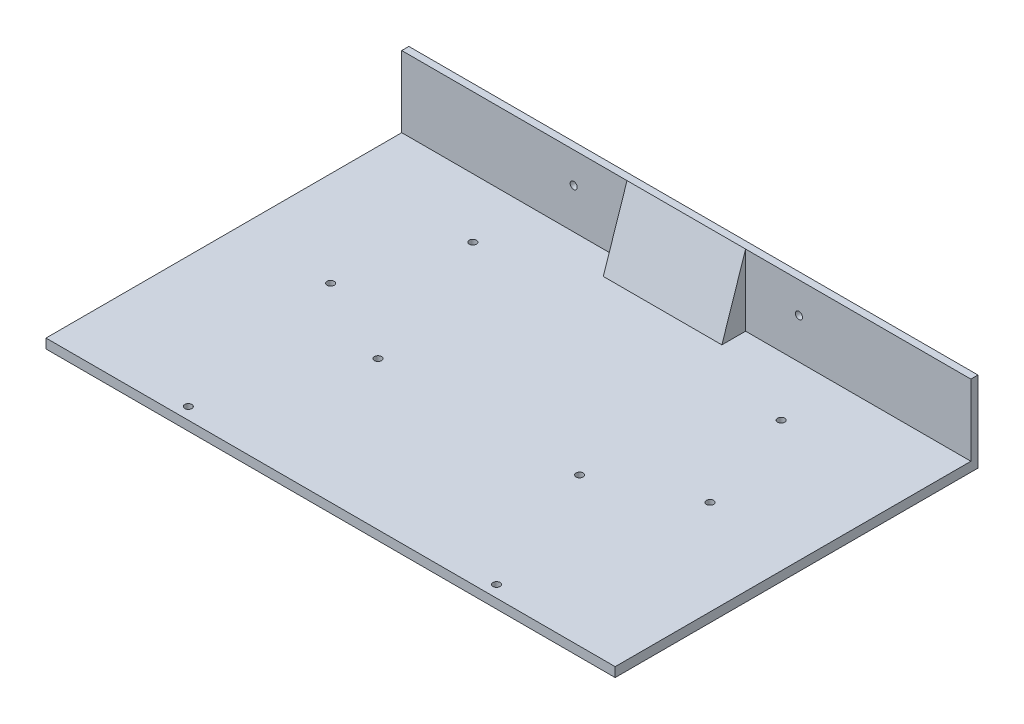
ISO-10303-21;
HEADER;
FILE_DESCRIPTION(('STEP AP214'),'2;1');
FILE_NAME('part.step','',(''),(''),'','','');
FILE_SCHEMA(('AUTOMOTIVE_DESIGN { 1 0 10303 214 1 1 1 1 }'));
ENDSEC;
DATA;
#1=APPLICATION_CONTEXT('core data for automotive mechanical design processes');
#2=APPLICATION_PROTOCOL_DEFINITION('international standard','automotive_design',2000,#1);
#3=PRODUCT_CONTEXT('',#1,'mechanical');
#4=PRODUCT('Part','Part','',(#3));
#5=PRODUCT_RELATED_PRODUCT_CATEGORY('part','',(#4));
#6=PRODUCT_DEFINITION_FORMATION('','',#4);
#7=PRODUCT_DEFINITION_CONTEXT('part definition',#1,'design');
#8=PRODUCT_DEFINITION('design','',#6,#7);
#9=PRODUCT_DEFINITION_SHAPE('','',#8);
#10=(LENGTH_UNIT() NAMED_UNIT(*) SI_UNIT(.MILLI.,.METRE.));
#11=(NAMED_UNIT(*) PLANE_ANGLE_UNIT() SI_UNIT($,.RADIAN.));
#12=(NAMED_UNIT(*) SI_UNIT($,.STERADIAN.) SOLID_ANGLE_UNIT());
#13=UNCERTAINTY_MEASURE_WITH_UNIT(LENGTH_MEASURE(1.E-05),#10,'distance_accuracy_value','');
#14=(GEOMETRIC_REPRESENTATION_CONTEXT(3) GLOBAL_UNCERTAINTY_ASSIGNED_CONTEXT((#13)) GLOBAL_UNIT_ASSIGNED_CONTEXT((#10,
#11,#12)) REPRESENTATION_CONTEXT('',''));
#15=CARTESIAN_POINT('',(0.,0.,0.));
#16=DIRECTION('',(0.,0.,1.));
#17=DIRECTION('',(1.,0.,0.));
#18=AXIS2_PLACEMENT_3D('',#15,#16,#17);
#19=CARTESIAN_POINT('',(0.,4.,0.));
#20=DIRECTION('',(0.,1.,0.));
#21=DIRECTION('',(0.,0.,1.));
#22=AXIS2_PLACEMENT_3D('',#19,#20,#21);
#23=PLANE('',#22);
#24=CARTESIAN_POINT('',(80.,4.,-5.));
#25=DIRECTION('',(0.,1.,0.));
#26=DIRECTION('',(0.,0.,1.));
#27=AXIS2_PLACEMENT_3D('',#24,#25,#26);
#28=CIRCLE('',#27,1.5);
#29=CARTESIAN_POINT('',(80.,4.,-3.50000000000001));
#30=VERTEX_POINT('',#29);
#31=EDGE_CURVE('E274',#30,#30,#28,.T.);
#32=ORIENTED_EDGE('',*,*,#31,.F.);
#33=EDGE_LOOP('',(#32));
#34=FACE_BOUND('',#33,.T.);
#35=CARTESIAN_POINT('',(-80.,4.,-5.));
#36=DIRECTION('',(0.,1.,0.));
#37=DIRECTION('',(0.,0.,1.));
#38=AXIS2_PLACEMENT_3D('',#35,#36,#37);
#39=CIRCLE('',#38,1.5);
#40=CARTESIAN_POINT('',(-80.,4.,-3.50000000000001));
#41=VERTEX_POINT('',#40);
#42=EDGE_CURVE('E284',#41,#41,#39,.T.);
#43=ORIENTED_EDGE('',*,*,#42,.F.);
#44=EDGE_LOOP('',(#43));
#45=FACE_BOUND('',#44,.T.);
#46=CARTESIAN_POINT('',(42.5,4.,12.5));
#47=DIRECTION('',(0.,1.,0.));
#48=DIRECTION('',(0.,0.,1.));
#49=AXIS2_PLACEMENT_3D('',#46,#47,#48);
#50=CIRCLE('',#49,1.5);
#51=CARTESIAN_POINT('',(42.5,4.,14.));
#52=VERTEX_POINT('',#51);
#53=EDGE_CURVE('E277',#52,#52,#50,.T.);
#54=ORIENTED_EDGE('',*,*,#53,.F.);
#55=EDGE_LOOP('',(#54));
#56=FACE_BOUND('',#55,.T.);
#57=CARTESIAN_POINT('',(-42.5,4.,12.5));
#58=DIRECTION('',(0.,1.,0.));
#59=DIRECTION('',(0.,0.,1.));
#60=AXIS2_PLACEMENT_3D('',#57,#58,#59);
#61=CIRCLE('',#60,1.5);
#62=CARTESIAN_POINT('',(-42.5,4.,14.));
#63=VERTEX_POINT('',#62);
#64=EDGE_CURVE('E270',#63,#63,#61,.T.);
#65=ORIENTED_EDGE('',*,*,#64,.F.);
#66=EDGE_LOOP('',(#65));
#67=FACE_BOUND('',#66,.T.);
#68=CARTESIAN_POINT('',(-65.,4.,70.));
#69=DIRECTION('',(0.,1.,0.));
#70=DIRECTION('',(0.,0.,1.));
#71=AXIS2_PLACEMENT_3D('',#68,#69,#70);
#72=CIRCLE('',#71,1.5);
#73=CARTESIAN_POINT('',(-65.,4.,71.5));
#74=VERTEX_POINT('',#73);
#75=EDGE_CURVE('E177',#74,#74,#72,.T.);
#76=ORIENTED_EDGE('',*,*,#75,.F.);
#77=EDGE_LOOP('',(#76));
#78=FACE_BOUND('',#77,.T.);
#79=CARTESIAN_POINT('',(65.,4.,70.));
#80=DIRECTION('',(0.,1.,0.));
#81=DIRECTION('',(0.,0.,1.));
#82=AXIS2_PLACEMENT_3D('',#79,#80,#81);
#83=CIRCLE('',#82,1.5);
#84=CARTESIAN_POINT('',(65.,4.,71.5));
#85=VERTEX_POINT('',#84);
#86=EDGE_CURVE('E182',#85,#85,#83,.T.);
#87=ORIENTED_EDGE('',*,*,#86,.F.);
#88=EDGE_LOOP('',(#87));
#89=FACE_BOUND('',#88,.T.);
#90=CARTESIAN_POINT('',(65.,4.,-50.));
#91=DIRECTION('',(0.,1.,0.));
#92=DIRECTION('',(0.,0.,1.));
#93=AXIS2_PLACEMENT_3D('',#90,#91,#92);
#94=CIRCLE('',#93,1.5);
#95=CARTESIAN_POINT('',(65.,4.,-48.5));
#96=VERTEX_POINT('',#95);
#97=EDGE_CURVE('E178',#96,#96,#94,.T.);
#98=ORIENTED_EDGE('',*,*,#97,.F.);
#99=EDGE_LOOP('',(#98));
#100=FACE_BOUND('',#99,.T.);
#101=CARTESIAN_POINT('',(-65.,4.,-50.));
#102=DIRECTION('',(0.,1.,0.));
#103=DIRECTION('',(0.,0.,1.));
#104=AXIS2_PLACEMENT_3D('',#101,#102,#103);
#105=CIRCLE('',#104,1.5);
#106=CARTESIAN_POINT('',(-65.,4.,-48.5));
#107=VERTEX_POINT('',#106);
#108=EDGE_CURVE('E181',#107,#107,#105,.T.);
#109=ORIENTED_EDGE('',*,*,#108,.F.);
#110=EDGE_LOOP('',(#109));
#111=FACE_BOUND('',#110,.T.);
#112=DIRECTION('',(-1.,0.,0.));
#113=VECTOR('',#112,1.);
#114=CARTESIAN_POINT('',(-120.,4.,-75.));
#115=LINE('',#114,#113);
#116=CARTESIAN_POINT('',(120.,4.,-75.));
#117=VERTEX_POINT('',#116);
#118=CARTESIAN_POINT('',(25.,4.,-75.));
#119=VERTEX_POINT('',#118);
#120=EDGE_CURVE('E128',#117,#119,#115,.T.);
#121=ORIENTED_EDGE('',*,*,#120,.T.);
#122=DIRECTION('',(0.,0.,-1.));
#123=VECTOR('',#122,1.);
#124=CARTESIAN_POINT('',(25.,4.,-75.));
#125=LINE('',#124,#123);
#126=CARTESIAN_POINT('',(25.,4.,-65.));
#127=VERTEX_POINT('',#126);
#128=EDGE_CURVE('E115',#127,#119,#125,.T.);
#129=ORIENTED_EDGE('',*,*,#128,.F.);
#130=DIRECTION('',(-1.,0.,0.));
#131=VECTOR('',#130,1.);
#132=CARTESIAN_POINT('',(25.,4.,-65.));
#133=LINE('',#132,#131);
#134=CARTESIAN_POINT('',(-25.,4.,-65.));
#135=VERTEX_POINT('',#134);
#136=EDGE_CURVE('E121',#127,#135,#133,.T.);
#137=ORIENTED_EDGE('',*,*,#136,.T.);
#138=DIRECTION('',(0.,0.,-1.));
#139=VECTOR('',#138,1.);
#140=CARTESIAN_POINT('',(-25.,4.,-75.));
#141=LINE('',#140,#139);
#142=CARTESIAN_POINT('',(-25.,4.,-75.));
#143=VERTEX_POINT('',#142);
#144=EDGE_CURVE('E137',#135,#143,#141,.T.);
#145=ORIENTED_EDGE('',*,*,#144,.T.);
#146=CARTESIAN_POINT('',(-120.,4.,-75.));
#147=VERTEX_POINT('',#146);
#148=EDGE_CURVE('E76',#143,#147,#115,.T.);
#149=ORIENTED_EDGE('',*,*,#148,.T.);
#150=DIRECTION('',(0.,0.,1.));
#151=VECTOR('',#150,1.);
#152=CARTESIAN_POINT('',(-120.,4.,-75.));
#153=LINE('',#152,#151);
#154=CARTESIAN_POINT('',(-120.,4.,75.));
#155=VERTEX_POINT('',#154);
#156=EDGE_CURVE('E193',#147,#155,#153,.T.);
#157=ORIENTED_EDGE('',*,*,#156,.T.);
#158=DIRECTION('',(1.,0.,0.));
#159=VECTOR('',#158,1.);
#160=CARTESIAN_POINT('',(-120.,4.,75.));
#161=LINE('',#160,#159);
#162=CARTESIAN_POINT('',(120.,4.,75.));
#163=VERTEX_POINT('',#162);
#164=EDGE_CURVE('E58',#155,#163,#161,.T.);
#165=ORIENTED_EDGE('',*,*,#164,.T.);
#166=DIRECTION('',(0.,0.,-1.));
#167=VECTOR('',#166,1.);
#168=CARTESIAN_POINT('',(120.,4.,-75.));
#169=LINE('',#168,#167);
#170=EDGE_CURVE('E190',#163,#117,#169,.T.);
#171=ORIENTED_EDGE('',*,*,#170,.T.);
#172=EDGE_LOOP('',(#121,#129,#137,#145,#149,#157,#165,#171));
#173=FACE_BOUND('',#172,.T.);
#174=ADVANCED_FACE('F32',(#34,#45,#56,#67,#78,#89,#100,#111,#173),#23,.T.);
#175=CARTESIAN_POINT('',(0.,0.,-75.));
#176=DIRECTION('',(0.,0.,1.));
#177=DIRECTION('',(1.,0.,0.));
#178=AXIS2_PLACEMENT_3D('',#175,#176,#177);
#179=PLANE('',#178);
#180=CARTESIAN_POINT('',(47.5,21.,-75.));
#181=DIRECTION('',(0.,0.,-1.));
#182=DIRECTION('',(-1.,0.,0.));
#183=AXIS2_PLACEMENT_3D('',#180,#181,#182);
#184=CIRCLE('',#183,1.5);
#185=CARTESIAN_POINT('',(46.,21.,-75.));
#186=VERTEX_POINT('',#185);
#187=EDGE_CURVE('E144',#186,#186,#184,.T.);
#188=ORIENTED_EDGE('',*,*,#187,.T.);
#189=EDGE_LOOP('',(#188));
#190=FACE_BOUND('',#189,.T.);
#191=DIRECTION('',(1.,0.,0.));
#192=VECTOR('',#191,1.);
#193=CARTESIAN_POINT('',(120.,34.,-75.));
#194=LINE('',#193,#192);
#195=CARTESIAN_POINT('',(25.,34.,-75.));
#196=VERTEX_POINT('',#195);
#197=CARTESIAN_POINT('',(120.,34.,-75.));
#198=VERTEX_POINT('',#197);
#199=EDGE_CURVE('E169',#196,#198,#194,.T.);
#200=ORIENTED_EDGE('',*,*,#199,.F.);
#201=DIRECTION('',(0.,1.,0.));
#202=VECTOR('',#201,1.);
#203=CARTESIAN_POINT('',(25.,34.,-75.));
#204=LINE('',#203,#202);
#205=EDGE_CURVE('E49',#119,#196,#204,.T.);
#206=ORIENTED_EDGE('',*,*,#205,.F.);
#207=ORIENTED_EDGE('',*,*,#120,.F.);
#208=DIRECTION('',(0.,-1.,0.));
#209=VECTOR('',#208,1.);
#210=CARTESIAN_POINT('',(120.,0.,-75.));
#211=LINE('',#210,#209);
#212=EDGE_CURVE('E150',#198,#117,#211,.T.);
#213=ORIENTED_EDGE('',*,*,#212,.F.);
#214=EDGE_LOOP('',(#200,#206,#207,#213));
#215=FACE_BOUND('',#214,.T.);
#216=ADVANCED_FACE('F228',(#190,#215),#179,.T.);
#217=CARTESIAN_POINT('',(120.,4.,-75.));
#218=DIRECTION('',(-1.,0.,0.));
#219=DIRECTION('',(0.,0.,1.));
#220=AXIS2_PLACEMENT_3D('',#217,#218,#219);
#221=PLANE('',#220);
#222=DIRECTION('',(0.,0.,-1.));
#223=VECTOR('',#222,1.);
#224=CARTESIAN_POINT('',(120.,0.,-75.));
#225=LINE('',#224,#223);
#226=CARTESIAN_POINT('',(120.,0.,75.));
#227=VERTEX_POINT('',#226);
#228=CARTESIAN_POINT('',(120.,0.,-78.));
#229=VERTEX_POINT('',#228);
#230=EDGE_CURVE('E196',#227,#229,#225,.T.);
#231=ORIENTED_EDGE('',*,*,#230,.T.);
#232=DIRECTION('',(0.,-1.,0.));
#233=VECTOR('',#232,1.);
#234=CARTESIAN_POINT('',(120.,0.,-78.));
#235=LINE('',#234,#233);
#236=CARTESIAN_POINT('',(120.,34.,-78.));
#237=VERTEX_POINT('',#236);
#238=EDGE_CURVE('E153',#237,#229,#235,.T.);
#239=ORIENTED_EDGE('',*,*,#238,.F.);
#240=DIRECTION('',(0.,0.,1.));
#241=VECTOR('',#240,1.);
#242=CARTESIAN_POINT('',(120.,34.,-78.));
#243=LINE('',#242,#241);
#244=EDGE_CURVE('E164',#237,#198,#243,.T.);
#245=ORIENTED_EDGE('',*,*,#244,.T.);
#246=ORIENTED_EDGE('',*,*,#212,.T.);
#247=ORIENTED_EDGE('',*,*,#170,.F.);
#248=DIRECTION('',(0.,-1.,0.));
#249=VECTOR('',#248,1.);
#250=CARTESIAN_POINT('',(120.,4.,75.));
#251=LINE('',#250,#249);
#252=EDGE_CURVE('E41',#163,#227,#251,.T.);
#253=ORIENTED_EDGE('',*,*,#252,.T.);
#254=EDGE_LOOP('',(#231,#239,#245,#246,#247,#253));
#255=FACE_BOUND('',#254,.T.);
#256=ADVANCED_FACE('F34',(#255),#221,.F.);
#257=CARTESIAN_POINT('',(-120.,4.,-75.));
#258=DIRECTION('',(1.,0.,0.));
#259=DIRECTION('',(0.,0.,-1.));
#260=AXIS2_PLACEMENT_3D('',#257,#258,#259);
#261=PLANE('',#260);
#262=DIRECTION('',(0.,0.,1.));
#263=VECTOR('',#262,1.);
#264=CARTESIAN_POINT('',(-120.,0.,-75.));
#265=LINE('',#264,#263);
#266=CARTESIAN_POINT('',(-120.,0.,-78.));
#267=VERTEX_POINT('',#266);
#268=CARTESIAN_POINT('',(-120.,0.,75.));
#269=VERTEX_POINT('',#268);
#270=EDGE_CURVE('E198',#267,#269,#265,.T.);
#271=ORIENTED_EDGE('',*,*,#270,.T.);
#272=DIRECTION('',(0.,-1.,0.));
#273=VECTOR('',#272,1.);
#274=CARTESIAN_POINT('',(-120.,4.,75.));
#275=LINE('',#274,#273);
#276=EDGE_CURVE('E11',#155,#269,#275,.T.);
#277=ORIENTED_EDGE('',*,*,#276,.F.);
#278=ORIENTED_EDGE('',*,*,#156,.F.);
#279=DIRECTION('',(0.,1.,0.));
#280=VECTOR('',#279,1.);
#281=CARTESIAN_POINT('',(-120.,0.,-75.));
#282=LINE('',#281,#280);
#283=CARTESIAN_POINT('',(-120.,34.,-75.));
#284=VERTEX_POINT('',#283);
#285=EDGE_CURVE('E167',#147,#284,#282,.T.);
#286=ORIENTED_EDGE('',*,*,#285,.T.);
#287=DIRECTION('',(0.,0.,1.));
#288=VECTOR('',#287,1.);
#289=CARTESIAN_POINT('',(-120.,34.,-78.));
#290=LINE('',#289,#288);
#291=CARTESIAN_POINT('',(-120.,34.,-78.));
#292=VERTEX_POINT('',#291);
#293=EDGE_CURVE('E174',#292,#284,#290,.T.);
#294=ORIENTED_EDGE('',*,*,#293,.F.);
#295=DIRECTION('',(0.,1.,0.));
#296=VECTOR('',#295,1.);
#297=CARTESIAN_POINT('',(-120.,0.,-78.));
#298=LINE('',#297,#296);
#299=EDGE_CURVE('E160',#267,#292,#298,.T.);
#300=ORIENTED_EDGE('',*,*,#299,.F.);
#301=EDGE_LOOP('',(#271,#277,#278,#286,#294,#300));
#302=FACE_BOUND('',#301,.T.);
#303=ADVANCED_FACE('F249',(#302),#261,.F.);
#304=CARTESIAN_POINT('',(-120.,4.,75.));
#305=DIRECTION('',(0.,0.,-1.));
#306=DIRECTION('',(-1.,0.,0.));
#307=AXIS2_PLACEMENT_3D('',#304,#305,#306);
#308=PLANE('',#307);
#309=DIRECTION('',(1.,0.,0.));
#310=VECTOR('',#309,1.);
#311=CARTESIAN_POINT('',(-120.,0.,75.));
#312=LINE('',#311,#310);
#313=EDGE_CURVE('E71',#269,#227,#312,.T.);
#314=ORIENTED_EDGE('',*,*,#313,.T.);
#315=ORIENTED_EDGE('',*,*,#252,.F.);
#316=ORIENTED_EDGE('',*,*,#164,.F.);
#317=ORIENTED_EDGE('',*,*,#276,.T.);
#318=EDGE_LOOP('',(#314,#315,#316,#317));
#319=FACE_BOUND('',#318,.T.);
#320=ADVANCED_FACE('F246',(#319),#308,.F.);
#321=CARTESIAN_POINT('',(0.,0.,0.));
#322=DIRECTION('',(0.,1.,0.));
#323=DIRECTION('',(0.,0.,1.));
#324=AXIS2_PLACEMENT_3D('',#321,#322,#323);
#325=PLANE('',#324);
#326=CARTESIAN_POINT('',(80.,0.,-5.));
#327=DIRECTION('',(0.,-1.,0.));
#328=DIRECTION('',(0.,0.,-1.));
#329=AXIS2_PLACEMENT_3D('',#326,#327,#328);
#330=CIRCLE('',#329,1.5);
#331=CARTESIAN_POINT('',(80.,0.,-6.5));
#332=VERTEX_POINT('',#331);
#333=EDGE_CURVE('E287',#332,#332,#330,.T.);
#334=ORIENTED_EDGE('',*,*,#333,.F.);
#335=EDGE_LOOP('',(#334));
#336=FACE_BOUND('',#335,.T.);
#337=CARTESIAN_POINT('',(-80.,0.,-5.));
#338=DIRECTION('',(0.,-1.,0.));
#339=DIRECTION('',(0.,0.,-1.));
#340=AXIS2_PLACEMENT_3D('',#337,#338,#339);
#341=CIRCLE('',#340,1.5);
#342=CARTESIAN_POINT('',(-80.,0.,-6.5));
#343=VERTEX_POINT('',#342);
#344=EDGE_CURVE('E288',#343,#343,#341,.T.);
#345=ORIENTED_EDGE('',*,*,#344,.F.);
#346=EDGE_LOOP('',(#345));
#347=FACE_BOUND('',#346,.T.);
#348=CARTESIAN_POINT('',(42.5,0.,12.5));
#349=DIRECTION('',(0.,1.,0.));
#350=DIRECTION('',(0.,0.,1.));
#351=AXIS2_PLACEMENT_3D('',#348,#349,#350);
#352=CIRCLE('',#351,1.5);
#353=CARTESIAN_POINT('',(42.5,0.,14.));
#354=VERTEX_POINT('',#353);
#355=EDGE_CURVE('E135',#354,#354,#352,.T.);
#356=ORIENTED_EDGE('',*,*,#355,.T.);
#357=EDGE_LOOP('',(#356));
#358=FACE_BOUND('',#357,.T.);
#359=CARTESIAN_POINT('',(-42.5,0.,12.5));
#360=DIRECTION('',(0.,1.,0.));
#361=DIRECTION('',(0.,0.,1.));
#362=AXIS2_PLACEMENT_3D('',#359,#360,#361);
#363=CIRCLE('',#362,1.5);
#364=CARTESIAN_POINT('',(-42.5,0.,14.));
#365=VERTEX_POINT('',#364);
#366=EDGE_CURVE('E273',#365,#365,#363,.T.);
#367=ORIENTED_EDGE('',*,*,#366,.T.);
#368=EDGE_LOOP('',(#367));
#369=FACE_BOUND('',#368,.T.);
#370=CARTESIAN_POINT('',(-65.,0.,70.));
#371=DIRECTION('',(0.,1.,0.));
#372=DIRECTION('',(0.,0.,1.));
#373=AXIS2_PLACEMENT_3D('',#370,#371,#372);
#374=CIRCLE('',#373,1.5);
#375=CARTESIAN_POINT('',(-65.,0.,71.5));
#376=VERTEX_POINT('',#375);
#377=EDGE_CURVE('E36',#376,#376,#374,.T.);
#378=ORIENTED_EDGE('',*,*,#377,.T.);
#379=EDGE_LOOP('',(#378));
#380=FACE_BOUND('',#379,.T.);
#381=CARTESIAN_POINT('',(65.,0.,70.));
#382=DIRECTION('',(0.,1.,0.));
#383=DIRECTION('',(0.,0.,1.));
#384=AXIS2_PLACEMENT_3D('',#381,#382,#383);
#385=CIRCLE('',#384,1.5);
#386=CARTESIAN_POINT('',(65.,0.,71.5));
#387=VERTEX_POINT('',#386);
#388=EDGE_CURVE('E206',#387,#387,#385,.T.);
#389=ORIENTED_EDGE('',*,*,#388,.T.);
#390=EDGE_LOOP('',(#389));
#391=FACE_BOUND('',#390,.T.);
#392=CARTESIAN_POINT('',(65.,0.,-50.));
#393=DIRECTION('',(0.,1.,0.));
#394=DIRECTION('',(0.,0.,1.));
#395=AXIS2_PLACEMENT_3D('',#392,#393,#394);
#396=CIRCLE('',#395,1.5);
#397=CARTESIAN_POINT('',(65.,0.,-48.5));
#398=VERTEX_POINT('',#397);
#399=EDGE_CURVE('E204',#398,#398,#396,.T.);
#400=ORIENTED_EDGE('',*,*,#399,.T.);
#401=EDGE_LOOP('',(#400));
#402=FACE_BOUND('',#401,.T.);
#403=CARTESIAN_POINT('',(-65.,0.,-50.));
#404=DIRECTION('',(0.,1.,0.));
#405=DIRECTION('',(0.,0.,1.));
#406=AXIS2_PLACEMENT_3D('',#403,#404,#405);
#407=CIRCLE('',#406,1.5);
#408=CARTESIAN_POINT('',(-65.,0.,-48.5));
#409=VERTEX_POINT('',#408);
#410=EDGE_CURVE('E189',#409,#409,#407,.T.);
#411=ORIENTED_EDGE('',*,*,#410,.T.);
#412=EDGE_LOOP('',(#411));
#413=FACE_BOUND('',#412,.T.);
#414=ORIENTED_EDGE('',*,*,#230,.F.);
#415=ORIENTED_EDGE('',*,*,#313,.F.);
#416=ORIENTED_EDGE('',*,*,#270,.F.);
#417=DIRECTION('',(-1.,0.,0.));
#418=VECTOR('',#417,1.);
#419=CARTESIAN_POINT('',(120.,0.,-78.));
#420=LINE('',#419,#418);
#421=EDGE_CURVE('E156',#229,#267,#420,.T.);
#422=ORIENTED_EDGE('',*,*,#421,.F.);
#423=EDGE_LOOP('',(#414,#415,#416,#422));
#424=FACE_BOUND('',#423,.T.);
#425=ADVANCED_FACE('F213',(#336,#347,#358,#369,#380,#391,#402,#413,#424),#325,.F.);
#426=CARTESIAN_POINT('',(-65.,-46.,-50.));
#427=DIRECTION('',(0.,1.,0.));
#428=DIRECTION('',(0.,0.,1.));
#429=AXIS2_PLACEMENT_3D('',#426,#427,#428);
#430=CYLINDRICAL_SURFACE('',#429,1.5);
#431=ORIENTED_EDGE('',*,*,#108,.T.);
#432=EDGE_LOOP('',(#431));
#433=FACE_BOUND('',#432,.T.);
#434=ORIENTED_EDGE('',*,*,#410,.F.);
#435=EDGE_LOOP('',(#434));
#436=FACE_BOUND('',#435,.T.);
#437=ADVANCED_FACE('F243',(#433,#436),#430,.F.);
#438=CARTESIAN_POINT('',(65.,-46.,-50.));
#439=DIRECTION('',(0.,1.,0.));
#440=DIRECTION('',(0.,0.,1.));
#441=AXIS2_PLACEMENT_3D('',#438,#439,#440);
#442=CYLINDRICAL_SURFACE('',#441,1.5);
#443=ORIENTED_EDGE('',*,*,#97,.T.);
#444=EDGE_LOOP('',(#443));
#445=FACE_BOUND('',#444,.T.);
#446=ORIENTED_EDGE('',*,*,#399,.F.);
#447=EDGE_LOOP('',(#446));
#448=FACE_BOUND('',#447,.T.);
#449=ADVANCED_FACE('F229',(#445,#448),#442,.F.);
#450=CARTESIAN_POINT('',(65.,-46.,70.));
#451=DIRECTION('',(0.,1.,0.));
#452=DIRECTION('',(0.,0.,1.));
#453=AXIS2_PLACEMENT_3D('',#450,#451,#452);
#454=CYLINDRICAL_SURFACE('',#453,1.5);
#455=ORIENTED_EDGE('',*,*,#86,.T.);
#456=EDGE_LOOP('',(#455));
#457=FACE_BOUND('',#456,.T.);
#458=ORIENTED_EDGE('',*,*,#388,.F.);
#459=EDGE_LOOP('',(#458));
#460=FACE_BOUND('',#459,.T.);
#461=ADVANCED_FACE('F218',(#457,#460),#454,.F.);
#462=CARTESIAN_POINT('',(-65.,-46.,70.));
#463=DIRECTION('',(0.,1.,0.));
#464=DIRECTION('',(0.,0.,1.));
#465=AXIS2_PLACEMENT_3D('',#462,#463,#464);
#466=CYLINDRICAL_SURFACE('',#465,1.5);
#467=ORIENTED_EDGE('',*,*,#75,.T.);
#468=EDGE_LOOP('',(#467));
#469=FACE_BOUND('',#468,.T.);
#470=ORIENTED_EDGE('',*,*,#377,.F.);
#471=EDGE_LOOP('',(#470));
#472=FACE_BOUND('',#471,.T.);
#473=ADVANCED_FACE('F215',(#469,#472),#466,.F.);
#474=DIRECTION('',(0.,1.,0.));
#475=VECTOR('',#474,1.);
#476=CARTESIAN_POINT('',(-25.,34.,-75.));
#477=LINE('',#476,#475);
#478=CARTESIAN_POINT('',(-25.,34.,-75.));
#479=VERTEX_POINT('',#478);
#480=EDGE_CURVE('E132',#143,#479,#477,.T.);
#481=ORIENTED_EDGE('',*,*,#480,.T.);
#482=EDGE_CURVE('E157',#284,#479,#194,.T.);
#483=ORIENTED_EDGE('',*,*,#482,.F.);
#484=ORIENTED_EDGE('',*,*,#285,.F.);
#485=ORIENTED_EDGE('',*,*,#148,.F.);
#486=EDGE_LOOP('',(#481,#483,#484,#485));
#487=FACE_BOUND('',#486,.T.);
#488=CARTESIAN_POINT('',(-47.5,21.,-75.));
#489=DIRECTION('',(0.,0.,-1.));
#490=DIRECTION('',(-1.,0.,0.));
#491=AXIS2_PLACEMENT_3D('',#488,#489,#490);
#492=CIRCLE('',#491,1.5);
#493=CARTESIAN_POINT('',(-49.,21.,-75.));
#494=VERTEX_POINT('',#493);
#495=EDGE_CURVE('E140',#494,#494,#492,.T.);
#496=ORIENTED_EDGE('',*,*,#495,.T.);
#497=EDGE_LOOP('',(#496));
#498=FACE_BOUND('',#497,.T.);
#499=ADVANCED_FACE('F217',(#487,#498),#179,.T.);
#500=CARTESIAN_POINT('',(0.,0.,-78.));
#501=DIRECTION('',(0.,0.,1.));
#502=DIRECTION('',(1.,0.,0.));
#503=AXIS2_PLACEMENT_3D('',#500,#501,#502);
#504=PLANE('',#503);
#505=ORIENTED_EDGE('',*,*,#238,.T.);
#506=ORIENTED_EDGE('',*,*,#421,.T.);
#507=ORIENTED_EDGE('',*,*,#299,.T.);
#508=DIRECTION('',(1.,0.,0.));
#509=VECTOR('',#508,1.);
#510=CARTESIAN_POINT('',(120.,34.,-78.));
#511=LINE('',#510,#509);
#512=EDGE_CURVE('E162',#292,#237,#511,.T.);
#513=ORIENTED_EDGE('',*,*,#512,.T.);
#514=EDGE_LOOP('',(#505,#506,#507,#513));
#515=FACE_BOUND('',#514,.T.);
#516=CARTESIAN_POINT('',(47.5,21.,-78.));
#517=DIRECTION('',(0.,0.,-1.));
#518=DIRECTION('',(-1.,0.,0.));
#519=AXIS2_PLACEMENT_3D('',#516,#517,#518);
#520=CIRCLE('',#519,1.5);
#521=CARTESIAN_POINT('',(46.,21.,-78.));
#522=VERTEX_POINT('',#521);
#523=EDGE_CURVE('E147',#522,#522,#520,.T.);
#524=ORIENTED_EDGE('',*,*,#523,.F.);
#525=EDGE_LOOP('',(#524));
#526=FACE_BOUND('',#525,.T.);
#527=CARTESIAN_POINT('',(-47.5,21.,-78.));
#528=DIRECTION('',(0.,0.,-1.));
#529=DIRECTION('',(-1.,0.,0.));
#530=AXIS2_PLACEMENT_3D('',#527,#528,#529);
#531=CIRCLE('',#530,1.5);
#532=CARTESIAN_POINT('',(-49.,21.,-78.));
#533=VERTEX_POINT('',#532);
#534=EDGE_CURVE('E141',#533,#533,#531,.T.);
#535=ORIENTED_EDGE('',*,*,#534,.F.);
#536=EDGE_LOOP('',(#535));
#537=FACE_BOUND('',#536,.T.);
#538=ADVANCED_FACE('F225',(#515,#526,#537),#504,.F.);
#539=CARTESIAN_POINT('',(120.,34.,-78.));
#540=DIRECTION('',(0.,-1.,0.));
#541=DIRECTION('',(0.,0.,-1.));
#542=AXIS2_PLACEMENT_3D('',#539,#540,#541);
#543=PLANE('',#542);
#544=ORIENTED_EDGE('',*,*,#482,.T.);
#545=DIRECTION('',(-1.,0.,0.));
#546=VECTOR('',#545,1.);
#547=CARTESIAN_POINT('',(25.,34.,-75.));
#548=LINE('',#547,#546);
#549=EDGE_CURVE('E125',#196,#479,#548,.T.);
#550=ORIENTED_EDGE('',*,*,#549,.F.);
#551=ORIENTED_EDGE('',*,*,#199,.T.);
#552=ORIENTED_EDGE('',*,*,#244,.F.);
#553=ORIENTED_EDGE('',*,*,#512,.F.);
#554=ORIENTED_EDGE('',*,*,#293,.T.);
#555=EDGE_LOOP('',(#544,#550,#551,#552,#553,#554));
#556=FACE_BOUND('',#555,.T.);
#557=ADVANCED_FACE('F332',(#556),#543,.F.);
#558=CARTESIAN_POINT('',(47.5,21.,-78.));
#559=DIRECTION('',(0.,0.,1.));
#560=DIRECTION('',(1.,0.,0.));
#561=AXIS2_PLACEMENT_3D('',#558,#559,#560);
#562=CYLINDRICAL_SURFACE('',#561,1.5);
#563=ORIENTED_EDGE('',*,*,#523,.T.);
#564=EDGE_LOOP('',(#563));
#565=FACE_BOUND('',#564,.T.);
#566=ORIENTED_EDGE('',*,*,#187,.F.);
#567=EDGE_LOOP('',(#566));
#568=FACE_BOUND('',#567,.T.);
#569=ADVANCED_FACE('F334',(#565,#568),#562,.F.);
#570=CARTESIAN_POINT('',(-47.5,21.,-78.));
#571=DIRECTION('',(0.,0.,1.));
#572=DIRECTION('',(1.,0.,0.));
#573=AXIS2_PLACEMENT_3D('',#570,#571,#572);
#574=CYLINDRICAL_SURFACE('',#573,1.5);
#575=ORIENTED_EDGE('',*,*,#534,.T.);
#576=EDGE_LOOP('',(#575));
#577=FACE_BOUND('',#576,.T.);
#578=ORIENTED_EDGE('',*,*,#495,.F.);
#579=EDGE_LOOP('',(#578));
#580=FACE_BOUND('',#579,.T.);
#581=ADVANCED_FACE('F342',(#577,#580),#574,.F.);
#582=CARTESIAN_POINT('',(25.,34.,-75.));
#583=DIRECTION('',(0.,-0.316227766016838,-0.948683298050514));
#584=DIRECTION('',(0.,0.948683298050514,-0.316227766016838));
#585=AXIS2_PLACEMENT_3D('',#582,#583,#584);
#586=PLANE('',#585);
#587=DIRECTION('',(0.,-0.948683298050514,0.316227766016838));
#588=VECTOR('',#587,1.);
#589=CARTESIAN_POINT('',(-25.,34.,-75.));
#590=LINE('',#589,#588);
#591=EDGE_CURVE('E123',#479,#135,#590,.T.);
#592=ORIENTED_EDGE('',*,*,#591,.T.);
#593=ORIENTED_EDGE('',*,*,#136,.F.);
#594=DIRECTION('',(0.,-0.948683298050514,0.316227766016838));
#595=VECTOR('',#594,1.);
#596=CARTESIAN_POINT('',(25.,34.,-75.));
#597=LINE('',#596,#595);
#598=EDGE_CURVE('E111',#196,#127,#597,.T.);
#599=ORIENTED_EDGE('',*,*,#598,.F.);
#600=ORIENTED_EDGE('',*,*,#549,.T.);
#601=EDGE_LOOP('',(#592,#593,#599,#600));
#602=FACE_BOUND('',#601,.T.);
#603=ADVANCED_FACE('F122',(#602),#586,.F.);
#604=CARTESIAN_POINT('',(25.,0.,0.));
#605=DIRECTION('',(-1.,0.,0.));
#606=DIRECTION('',(0.,0.,1.));
#607=AXIS2_PLACEMENT_3D('',#604,#605,#606);
#608=PLANE('',#607);
#609=ORIENTED_EDGE('',*,*,#205,.T.);
#610=ORIENTED_EDGE('',*,*,#598,.T.);
#611=ORIENTED_EDGE('',*,*,#128,.T.);
#612=EDGE_LOOP('',(#609,#610,#611));
#613=FACE_BOUND('',#612,.T.);
#614=ADVANCED_FACE('F113',(#613),#608,.F.);
#615=CARTESIAN_POINT('',(-25.,0.,0.));
#616=DIRECTION('',(-1.,0.,0.));
#617=DIRECTION('',(0.,0.,1.));
#618=AXIS2_PLACEMENT_3D('',#615,#616,#617);
#619=PLANE('',#618);
#620=ORIENTED_EDGE('',*,*,#480,.F.);
#621=ORIENTED_EDGE('',*,*,#144,.F.);
#622=ORIENTED_EDGE('',*,*,#591,.F.);
#623=EDGE_LOOP('',(#620,#621,#622));
#624=FACE_BOUND('',#623,.T.);
#625=ADVANCED_FACE('F306',(#624),#619,.T.);
#626=CARTESIAN_POINT('',(-42.5,0.,12.5));
#627=DIRECTION('',(0.,1.,0.));
#628=DIRECTION('',(0.,0.,1.));
#629=AXIS2_PLACEMENT_3D('',#626,#627,#628);
#630=CYLINDRICAL_SURFACE('',#629,1.5);
#631=ORIENTED_EDGE('',*,*,#366,.F.);
#632=EDGE_LOOP('',(#631));
#633=FACE_BOUND('',#632,.T.);
#634=ORIENTED_EDGE('',*,*,#64,.T.);
#635=EDGE_LOOP('',(#634));
#636=FACE_BOUND('',#635,.T.);
#637=ADVANCED_FACE('F302',(#633,#636),#630,.F.);
#638=CARTESIAN_POINT('',(42.5,0.,12.5));
#639=DIRECTION('',(0.,1.,0.));
#640=DIRECTION('',(0.,0.,1.));
#641=AXIS2_PLACEMENT_3D('',#638,#639,#640);
#642=CYLINDRICAL_SURFACE('',#641,1.5);
#643=ORIENTED_EDGE('',*,*,#355,.F.);
#644=EDGE_LOOP('',(#643));
#645=FACE_BOUND('',#644,.T.);
#646=ORIENTED_EDGE('',*,*,#53,.T.);
#647=EDGE_LOOP('',(#646));
#648=FACE_BOUND('',#647,.T.);
#649=ADVANCED_FACE('F305',(#645,#648),#642,.F.);
#650=CARTESIAN_POINT('',(-80.,10.,-5.));
#651=DIRECTION('',(0.,-1.,0.));
#652=DIRECTION('',(0.,0.,-1.));
#653=AXIS2_PLACEMENT_3D('',#650,#651,#652);
#654=CYLINDRICAL_SURFACE('',#653,1.5);
#655=ORIENTED_EDGE('',*,*,#42,.T.);
#656=EDGE_LOOP('',(#655));
#657=FACE_BOUND('',#656,.T.);
#658=ORIENTED_EDGE('',*,*,#344,.T.);
#659=EDGE_LOOP('',(#658));
#660=FACE_BOUND('',#659,.T.);
#661=ADVANCED_FACE('F356',(#657,#660),#654,.F.);
#662=CARTESIAN_POINT('',(80.,10.,-5.));
#663=DIRECTION('',(0.,-1.,0.));
#664=DIRECTION('',(0.,0.,-1.));
#665=AXIS2_PLACEMENT_3D('',#662,#663,#664);
#666=CYLINDRICAL_SURFACE('',#665,1.5);
#667=ORIENTED_EDGE('',*,*,#31,.T.);
#668=EDGE_LOOP('',(#667));
#669=FACE_BOUND('',#668,.T.);
#670=ORIENTED_EDGE('',*,*,#333,.T.);
#671=EDGE_LOOP('',(#670));
#672=FACE_BOUND('',#671,.T.);
#673=ADVANCED_FACE('F294',(#669,#672),#666,.F.);
#674=CLOSED_SHELL('',(#174,#216,#256,#303,#320,#425,#437,#449,#461,#473,#499,#538,#557,#569,
#581,#603,#614,#625,#637,#649,#661,#673));
#675=MANIFOLD_SOLID_BREP('B2',#674);
#676=ADVANCED_BREP_SHAPE_REPRESENTATION('',(#18,#675),#14);
#677=SHAPE_DEFINITION_REPRESENTATION(#9,#676);
ENDSEC;
END-ISO-10303-21;
